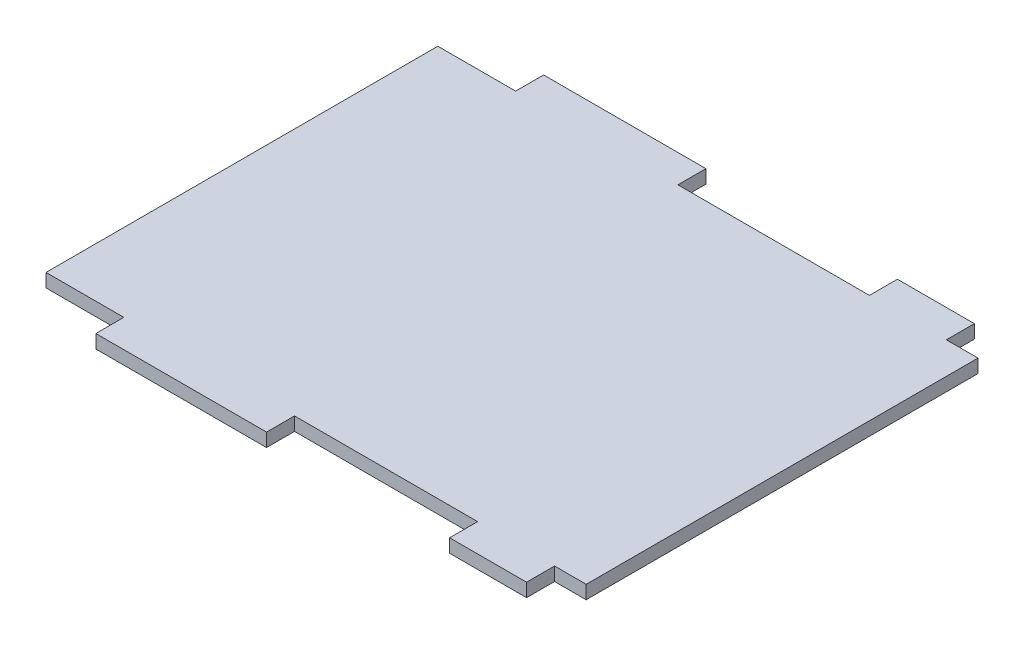
ISO-10303-21;
HEADER;
FILE_DESCRIPTION(('STEP AP214'),'2;1');
FILE_NAME('part.step','',(''),(''),'','','');
FILE_SCHEMA(('AUTOMOTIVE_DESIGN { 1 0 10303 214 1 1 1 1 }'));
ENDSEC;
DATA;
#1=APPLICATION_CONTEXT('core data for automotive mechanical design processes');
#2=APPLICATION_PROTOCOL_DEFINITION('international standard','automotive_design',2000,#1);
#3=PRODUCT_CONTEXT('',#1,'mechanical');
#4=PRODUCT('Part','Part','',(#3));
#5=PRODUCT_RELATED_PRODUCT_CATEGORY('part','',(#4));
#6=PRODUCT_DEFINITION_FORMATION('','',#4);
#7=PRODUCT_DEFINITION_CONTEXT('part definition',#1,'design');
#8=PRODUCT_DEFINITION('design','',#6,#7);
#9=PRODUCT_DEFINITION_SHAPE('','',#8);
#10=(LENGTH_UNIT() NAMED_UNIT(*) SI_UNIT(.MILLI.,.METRE.));
#11=(NAMED_UNIT(*) PLANE_ANGLE_UNIT() SI_UNIT($,.RADIAN.));
#12=(NAMED_UNIT(*) SI_UNIT($,.STERADIAN.) SOLID_ANGLE_UNIT());
#13=UNCERTAINTY_MEASURE_WITH_UNIT(LENGTH_MEASURE(1.E-05),#10,'distance_accuracy_value','');
#14=(GEOMETRIC_REPRESENTATION_CONTEXT(3) GLOBAL_UNCERTAINTY_ASSIGNED_CONTEXT((#13)) GLOBAL_UNIT_ASSIGNED_CONTEXT((#10,
#11,#12)) REPRESENTATION_CONTEXT('',''));
#15=CARTESIAN_POINT('',(0.,0.,0.));
#16=DIRECTION('',(0.,0.,1.));
#17=DIRECTION('',(1.,0.,0.));
#18=AXIS2_PLACEMENT_3D('',#15,#16,#17);
#19=CARTESIAN_POINT('',(0.,4.8,70.));
#20=DIRECTION('',(0.,0.,-1.));
#21=DIRECTION('',(-1.,0.,0.));
#22=AXIS2_PLACEMENT_3D('',#19,#20,#21);
#23=PLANE('',#22);
#24=DIRECTION('',(1.,0.,0.));
#25=VECTOR('',#24,1.);
#26=CARTESIAN_POINT('',(0.,0.,70.));
#27=LINE('',#26,#25);
#28=CARTESIAN_POINT('',(-96.5,0.,70.));
#29=VERTEX_POINT('',#28);
#30=CARTESIAN_POINT('',(-68.7,0.,70.));
#31=VERTEX_POINT('',#30);
#32=EDGE_CURVE('E325',#29,#31,#27,.T.);
#33=ORIENTED_EDGE('',*,*,#32,.T.);
#34=DIRECTION('',(0.,-1.,0.));
#35=VECTOR('',#34,1.);
#36=CARTESIAN_POINT('',(-68.7,4.8,70.));
#37=LINE('',#36,#35);
#38=CARTESIAN_POINT('',(-68.7,4.8,70.));
#39=VERTEX_POINT('',#38);
#40=EDGE_CURVE('E11',#39,#31,#37,.T.);
#41=ORIENTED_EDGE('',*,*,#40,.F.);
#42=DIRECTION('',(1.,0.,0.));
#43=VECTOR('',#42,1.);
#44=CARTESIAN_POINT('',(0.,4.8,70.));
#45=LINE('',#44,#43);
#46=CARTESIAN_POINT('',(-96.5,4.8,70.));
#47=VERTEX_POINT('',#46);
#48=EDGE_CURVE('E230',#47,#39,#45,.T.);
#49=ORIENTED_EDGE('',*,*,#48,.F.);
#50=DIRECTION('',(0.,-1.,0.));
#51=VECTOR('',#50,1.);
#52=CARTESIAN_POINT('',(-96.5,4.8,70.));
#53=LINE('',#52,#51);
#54=EDGE_CURVE('E61',#47,#29,#53,.T.);
#55=ORIENTED_EDGE('',*,*,#54,.T.);
#56=EDGE_LOOP('',(#33,#41,#49,#55));
#57=FACE_BOUND('',#56,.T.);
#58=ADVANCED_FACE('F44',(#57),#23,.F.);
#59=CARTESIAN_POINT('',(-68.7,4.8,0.));
#60=DIRECTION('',(1.,0.,0.));
#61=DIRECTION('',(0.,0.,-1.));
#62=AXIS2_PLACEMENT_3D('',#59,#60,#61);
#63=PLANE('',#62);
#64=DIRECTION('',(0.,0.,1.));
#65=VECTOR('',#64,1.);
#66=CARTESIAN_POINT('',(-68.7,0.,0.));
#67=LINE('',#66,#65);
#68=CARTESIAN_POINT('',(-68.7,0.,80.));
#69=VERTEX_POINT('',#68);
#70=EDGE_CURVE('E320',#31,#69,#67,.T.);
#71=ORIENTED_EDGE('',*,*,#70,.T.);
#72=DIRECTION('',(0.,-1.,0.));
#73=VECTOR('',#72,1.);
#74=CARTESIAN_POINT('',(-68.7,4.8,80.));
#75=LINE('',#74,#73);
#76=CARTESIAN_POINT('',(-68.7,4.8,80.));
#77=VERTEX_POINT('',#76);
#78=EDGE_CURVE('E53',#77,#69,#75,.T.);
#79=ORIENTED_EDGE('',*,*,#78,.F.);
#80=DIRECTION('',(0.,0.,1.));
#81=VECTOR('',#80,1.);
#82=CARTESIAN_POINT('',(-68.7,4.8,0.));
#83=LINE('',#82,#81);
#84=EDGE_CURVE('E135',#39,#77,#83,.T.);
#85=ORIENTED_EDGE('',*,*,#84,.F.);
#86=ORIENTED_EDGE('',*,*,#40,.T.);
#87=EDGE_LOOP('',(#71,#79,#85,#86));
#88=FACE_BOUND('',#87,.T.);
#89=ADVANCED_FACE('F46',(#88),#63,.F.);
#90=CARTESIAN_POINT('',(0.,4.8,80.));
#91=DIRECTION('',(0.,0.,-1.));
#92=DIRECTION('',(-1.,0.,0.));
#93=AXIS2_PLACEMENT_3D('',#90,#91,#92);
#94=PLANE('',#93);
#95=DIRECTION('',(1.,0.,0.));
#96=VECTOR('',#95,1.);
#97=CARTESIAN_POINT('',(0.,0.,80.));
#98=LINE('',#97,#96);
#99=CARTESIAN_POINT('',(-7.70000000000001,0.,80.));
#100=VERTEX_POINT('',#99);
#101=EDGE_CURVE('E316',#69,#100,#98,.T.);
#102=ORIENTED_EDGE('',*,*,#101,.T.);
#103=DIRECTION('',(0.,-1.,0.));
#104=VECTOR('',#103,1.);
#105=CARTESIAN_POINT('',(-7.70000000000001,4.8,80.));
#106=LINE('',#105,#104);
#107=CARTESIAN_POINT('',(-7.70000000000001,4.8,80.));
#108=VERTEX_POINT('',#107);
#109=EDGE_CURVE('E308',#108,#100,#106,.T.);
#110=ORIENTED_EDGE('',*,*,#109,.F.);
#111=DIRECTION('',(1.,0.,0.));
#112=VECTOR('',#111,1.);
#113=CARTESIAN_POINT('',(0.,4.8,80.));
#114=LINE('',#113,#112);
#115=EDGE_CURVE('E241',#77,#108,#114,.T.);
#116=ORIENTED_EDGE('',*,*,#115,.F.);
#117=ORIENTED_EDGE('',*,*,#78,.T.);
#118=EDGE_LOOP('',(#102,#110,#116,#117));
#119=FACE_BOUND('',#118,.T.);
#120=ADVANCED_FACE('F314',(#119),#94,.F.);
#121=CARTESIAN_POINT('',(-7.70000000000002,4.8,0.));
#122=DIRECTION('',(1.,0.,0.));
#123=DIRECTION('',(0.,0.,-1.));
#124=AXIS2_PLACEMENT_3D('',#121,#122,#123);
#125=PLANE('',#124);
#126=DIRECTION('',(0.,0.,1.));
#127=VECTOR('',#126,1.);
#128=CARTESIAN_POINT('',(-7.70000000000002,0.,0.));
#129=LINE('',#128,#127);
#130=CARTESIAN_POINT('',(-7.70000000000001,0.,70.));
#131=VERTEX_POINT('',#130);
#132=EDGE_CURVE('E322',#131,#100,#129,.T.);
#133=ORIENTED_EDGE('',*,*,#132,.F.);
#134=DIRECTION('',(0.,-1.,0.));
#135=VECTOR('',#134,1.);
#136=CARTESIAN_POINT('',(-7.70000000000001,4.8,70.));
#137=LINE('',#136,#135);
#138=CARTESIAN_POINT('',(-7.70000000000001,4.8,70.));
#139=VERTEX_POINT('',#138);
#140=EDGE_CURVE('E261',#139,#131,#137,.T.);
#141=ORIENTED_EDGE('',*,*,#140,.F.);
#142=DIRECTION('',(0.,0.,1.));
#143=VECTOR('',#142,1.);
#144=CARTESIAN_POINT('',(-7.70000000000002,4.8,0.));
#145=LINE('',#144,#143);
#146=EDGE_CURVE('E238',#139,#108,#145,.T.);
#147=ORIENTED_EDGE('',*,*,#146,.T.);
#148=ORIENTED_EDGE('',*,*,#109,.T.);
#149=EDGE_LOOP('',(#133,#141,#147,#148));
#150=FACE_BOUND('',#149,.T.);
#151=ADVANCED_FACE('F406',(#150),#125,.T.);
#152=CARTESIAN_POINT('',(57.7138007849793,0.,70.));
#153=VERTEX_POINT('',#152);
#154=EDGE_CURVE('E258',#131,#153,#27,.T.);
#155=ORIENTED_EDGE('',*,*,#154,.T.);
#156=DIRECTION('',(0.,-1.,0.));
#157=VECTOR('',#156,1.);
#158=CARTESIAN_POINT('',(57.7138007849793,4.8,70.));
#159=LINE('',#158,#157);
#160=CARTESIAN_POINT('',(57.7138007849793,4.8,70.));
#161=VERTEX_POINT('',#160);
#162=EDGE_CURVE('E255',#161,#153,#159,.T.);
#163=ORIENTED_EDGE('',*,*,#162,.F.);
#164=EDGE_CURVE('E229',#139,#161,#45,.T.);
#165=ORIENTED_EDGE('',*,*,#164,.F.);
#166=ORIENTED_EDGE('',*,*,#140,.T.);
#167=EDGE_LOOP('',(#155,#163,#165,#166));
#168=FACE_BOUND('',#167,.T.);
#169=ADVANCED_FACE('F256',(#168),#23,.F.);
#170=CARTESIAN_POINT('',(57.7138007849793,4.8,0.));
#171=DIRECTION('',(1.,0.,0.));
#172=DIRECTION('',(0.,0.,-1.));
#173=AXIS2_PLACEMENT_3D('',#170,#171,#172);
#174=PLANE('',#173);
#175=DIRECTION('',(0.,0.,1.));
#176=VECTOR('',#175,1.);
#177=CARTESIAN_POINT('',(57.7138007849793,0.,0.));
#178=LINE('',#177,#176);
#179=CARTESIAN_POINT('',(57.7138007849793,0.,80.));
#180=VERTEX_POINT('',#179);
#181=EDGE_CURVE('E267',#153,#180,#178,.T.);
#182=ORIENTED_EDGE('',*,*,#181,.T.);
#183=DIRECTION('',(0.,-1.,0.));
#184=VECTOR('',#183,1.);
#185=CARTESIAN_POINT('',(57.7138007849793,4.8,80.));
#186=LINE('',#185,#184);
#187=CARTESIAN_POINT('',(57.7138007849793,4.8,80.));
#188=VERTEX_POINT('',#187);
#189=EDGE_CURVE('E262',#188,#180,#186,.T.);
#190=ORIENTED_EDGE('',*,*,#189,.F.);
#191=DIRECTION('',(0.,0.,1.));
#192=VECTOR('',#191,1.);
#193=CARTESIAN_POINT('',(57.7138007849793,4.8,0.));
#194=LINE('',#193,#192);
#195=EDGE_CURVE('E236',#161,#188,#194,.T.);
#196=ORIENTED_EDGE('',*,*,#195,.F.);
#197=ORIENTED_EDGE('',*,*,#162,.T.);
#198=EDGE_LOOP('',(#182,#190,#196,#197));
#199=FACE_BOUND('',#198,.T.);
#200=ADVANCED_FACE('F264',(#199),#174,.F.);
#201=CARTESIAN_POINT('',(0.,4.8,80.));
#202=DIRECTION('',(0.,0.,-1.));
#203=DIRECTION('',(-1.,0.,0.));
#204=AXIS2_PLACEMENT_3D('',#201,#202,#203);
#205=PLANE('',#204);
#206=DIRECTION('',(1.,0.,0.));
#207=VECTOR('',#206,1.);
#208=CARTESIAN_POINT('',(0.,0.,80.));
#209=LINE('',#208,#207);
#210=CARTESIAN_POINT('',(85.1965630635409,0.,80.));
#211=VERTEX_POINT('',#210);
#212=EDGE_CURVE('E330',#180,#211,#209,.T.);
#213=ORIENTED_EDGE('',*,*,#212,.T.);
#214=DIRECTION('',(0.,-1.,0.));
#215=VECTOR('',#214,1.);
#216=CARTESIAN_POINT('',(85.1965630635409,4.8,80.));
#217=LINE('',#216,#215);
#218=CARTESIAN_POINT('',(85.1965630635409,4.8,80.));
#219=VERTEX_POINT('',#218);
#220=EDGE_CURVE('E271',#219,#211,#217,.T.);
#221=ORIENTED_EDGE('',*,*,#220,.F.);
#222=DIRECTION('',(1.,0.,0.));
#223=VECTOR('',#222,1.);
#224=CARTESIAN_POINT('',(0.,4.8,80.));
#225=LINE('',#224,#223);
#226=EDGE_CURVE('E234',#188,#219,#225,.T.);
#227=ORIENTED_EDGE('',*,*,#226,.F.);
#228=ORIENTED_EDGE('',*,*,#189,.T.);
#229=EDGE_LOOP('',(#213,#221,#227,#228));
#230=FACE_BOUND('',#229,.T.);
#231=ADVANCED_FACE('F274',(#230),#205,.F.);
#232=CARTESIAN_POINT('',(85.1965630635409,4.8,0.));
#233=DIRECTION('',(1.,0.,0.));
#234=DIRECTION('',(0.,0.,-1.));
#235=AXIS2_PLACEMENT_3D('',#232,#233,#234);
#236=PLANE('',#235);
#237=DIRECTION('',(0.,0.,1.));
#238=VECTOR('',#237,1.);
#239=CARTESIAN_POINT('',(85.1965630635409,0.,0.));
#240=LINE('',#239,#238);
#241=CARTESIAN_POINT('',(85.1965630635409,0.,70.));
#242=VERTEX_POINT('',#241);
#243=EDGE_CURVE('E283',#242,#211,#240,.T.);
#244=ORIENTED_EDGE('',*,*,#243,.F.);
#245=DIRECTION('',(0.,-1.,0.));
#246=VECTOR('',#245,1.);
#247=CARTESIAN_POINT('',(85.1965630635409,4.8,70.));
#248=LINE('',#247,#246);
#249=CARTESIAN_POINT('',(85.1965630635409,4.8,70.));
#250=VERTEX_POINT('',#249);
#251=EDGE_CURVE('E281',#250,#242,#248,.T.);
#252=ORIENTED_EDGE('',*,*,#251,.F.);
#253=DIRECTION('',(0.,0.,1.));
#254=VECTOR('',#253,1.);
#255=CARTESIAN_POINT('',(85.1965630635409,4.8,0.));
#256=LINE('',#255,#254);
#257=EDGE_CURVE('E227',#250,#219,#256,.T.);
#258=ORIENTED_EDGE('',*,*,#257,.T.);
#259=ORIENTED_EDGE('',*,*,#220,.T.);
#260=EDGE_LOOP('',(#244,#252,#258,#259));
#261=FACE_BOUND('',#260,.T.);
#262=ADVANCED_FACE('F280',(#261),#236,.T.);
#263=CARTESIAN_POINT('',(96.5,0.,70.));
#264=VERTEX_POINT('',#263);
#265=EDGE_CURVE('E290',#242,#264,#27,.T.);
#266=ORIENTED_EDGE('',*,*,#265,.T.);
#267=DIRECTION('',(0.,-1.,0.));
#268=VECTOR('',#267,1.);
#269=CARTESIAN_POINT('',(96.5,4.8,70.));
#270=LINE('',#269,#268);
#271=CARTESIAN_POINT('',(96.5,4.8,70.));
#272=VERTEX_POINT('',#271);
#273=EDGE_CURVE('E286',#272,#264,#270,.T.);
#274=ORIENTED_EDGE('',*,*,#273,.F.);
#275=EDGE_CURVE('E224',#250,#272,#45,.T.);
#276=ORIENTED_EDGE('',*,*,#275,.F.);
#277=ORIENTED_EDGE('',*,*,#251,.T.);
#278=EDGE_LOOP('',(#266,#274,#276,#277));
#279=FACE_BOUND('',#278,.T.);
#280=ADVANCED_FACE('F288',(#279),#23,.F.);
#281=CARTESIAN_POINT('',(96.5,4.8,0.));
#282=DIRECTION('',(-1.,0.,0.));
#283=DIRECTION('',(0.,0.,1.));
#284=AXIS2_PLACEMENT_3D('',#281,#282,#283);
#285=PLANE('',#284);
#286=DIRECTION('',(0.,0.,-1.));
#287=VECTOR('',#286,1.);
#288=CARTESIAN_POINT('',(96.5,0.,0.));
#289=LINE('',#288,#287);
#290=CARTESIAN_POINT('',(96.5,0.,-70.));
#291=VERTEX_POINT('',#290);
#292=EDGE_CURVE('E297',#264,#291,#289,.T.);
#293=ORIENTED_EDGE('',*,*,#292,.T.);
#294=DIRECTION('',(0.,-1.,0.));
#295=VECTOR('',#294,1.);
#296=CARTESIAN_POINT('',(96.5,4.8,-70.));
#297=LINE('',#296,#295);
#298=CARTESIAN_POINT('',(96.5,4.8,-70.));
#299=VERTEX_POINT('',#298);
#300=EDGE_CURVE('E294',#299,#291,#297,.T.);
#301=ORIENTED_EDGE('',*,*,#300,.F.);
#302=DIRECTION('',(0.,0.,-1.));
#303=VECTOR('',#302,1.);
#304=CARTESIAN_POINT('',(96.5,4.8,0.));
#305=LINE('',#304,#303);
#306=EDGE_CURVE('E220',#272,#299,#305,.T.);
#307=ORIENTED_EDGE('',*,*,#306,.F.);
#308=ORIENTED_EDGE('',*,*,#273,.T.);
#309=EDGE_LOOP('',(#293,#301,#307,#308));
#310=FACE_BOUND('',#309,.T.);
#311=ADVANCED_FACE('F296',(#310),#285,.F.);
#312=CARTESIAN_POINT('',(0.,4.8,-70.));
#313=DIRECTION('',(0.,0.,-1.));
#314=DIRECTION('',(-1.,0.,0.));
#315=AXIS2_PLACEMENT_3D('',#312,#313,#314);
#316=PLANE('',#315);
#317=DIRECTION('',(1.,0.,0.));
#318=VECTOR('',#317,1.);
#319=CARTESIAN_POINT('',(0.,0.,-70.));
#320=LINE('',#319,#318);
#321=CARTESIAN_POINT('',(85.1965630635409,0.,-70.));
#322=VERTEX_POINT('',#321);
#323=EDGE_CURVE('E334',#322,#291,#320,.T.);
#324=ORIENTED_EDGE('',*,*,#323,.F.);
#325=DIRECTION('',(0.,-1.,0.));
#326=VECTOR('',#325,1.);
#327=CARTESIAN_POINT('',(85.1965630635409,4.8,-70.));
#328=LINE('',#327,#326);
#329=CARTESIAN_POINT('',(85.1965630635409,4.8,-70.));
#330=VERTEX_POINT('',#329);
#331=EDGE_CURVE('E300',#330,#322,#328,.T.);
#332=ORIENTED_EDGE('',*,*,#331,.F.);
#333=DIRECTION('',(1.,0.,0.));
#334=VECTOR('',#333,1.);
#335=CARTESIAN_POINT('',(0.,4.8,-70.));
#336=LINE('',#335,#334);
#337=EDGE_CURVE('E211',#330,#299,#336,.T.);
#338=ORIENTED_EDGE('',*,*,#337,.T.);
#339=ORIENTED_EDGE('',*,*,#300,.T.);
#340=EDGE_LOOP('',(#324,#332,#338,#339));
#341=FACE_BOUND('',#340,.T.);
#342=ADVANCED_FACE('F395',(#341),#316,.T.);
#343=CARTESIAN_POINT('',(85.1965630635409,4.8,0.));
#344=DIRECTION('',(-1.,0.,0.));
#345=DIRECTION('',(0.,0.,1.));
#346=AXIS2_PLACEMENT_3D('',#343,#344,#345);
#347=PLANE('',#346);
#348=DIRECTION('',(0.,0.,-1.));
#349=VECTOR('',#348,1.);
#350=CARTESIAN_POINT('',(85.1965630635409,0.,0.));
#351=LINE('',#350,#349);
#352=CARTESIAN_POINT('',(85.1965630635409,0.,-80.));
#353=VERTEX_POINT('',#352);
#354=EDGE_CURVE('E336',#322,#353,#351,.T.);
#355=ORIENTED_EDGE('',*,*,#354,.T.);
#356=DIRECTION('',(0.,-1.,0.));
#357=VECTOR('',#356,1.);
#358=CARTESIAN_POINT('',(85.1965630635409,4.8,-80.));
#359=LINE('',#358,#357);
#360=CARTESIAN_POINT('',(85.1965630635409,4.8,-80.));
#361=VERTEX_POINT('',#360);
#362=EDGE_CURVE('E302',#361,#353,#359,.T.);
#363=ORIENTED_EDGE('',*,*,#362,.F.);
#364=DIRECTION('',(0.,0.,-1.));
#365=VECTOR('',#364,1.);
#366=CARTESIAN_POINT('',(85.1965630635409,4.8,0.));
#367=LINE('',#366,#365);
#368=EDGE_CURVE('E219',#330,#361,#367,.T.);
#369=ORIENTED_EDGE('',*,*,#368,.F.);
#370=ORIENTED_EDGE('',*,*,#331,.T.);
#371=EDGE_LOOP('',(#355,#363,#369,#370));
#372=FACE_BOUND('',#371,.T.);
#373=ADVANCED_FACE('F372',(#372),#347,.F.);
#374=CARTESIAN_POINT('',(0.,4.8,-80.));
#375=DIRECTION('',(0.,0.,-1.));
#376=DIRECTION('',(-1.,0.,0.));
#377=AXIS2_PLACEMENT_3D('',#374,#375,#376);
#378=PLANE('',#377);
#379=DIRECTION('',(1.,0.,0.));
#380=VECTOR('',#379,1.);
#381=CARTESIAN_POINT('',(0.,0.,-80.));
#382=LINE('',#381,#380);
#383=CARTESIAN_POINT('',(57.7138007849793,0.,-80.));
#384=VERTEX_POINT('',#383);
#385=EDGE_CURVE('E340',#384,#353,#382,.T.);
#386=ORIENTED_EDGE('',*,*,#385,.F.);
#387=DIRECTION('',(0.,-1.,0.));
#388=VECTOR('',#387,1.);
#389=CARTESIAN_POINT('',(57.7138007849793,4.8,-80.));
#390=LINE('',#389,#388);
#391=CARTESIAN_POINT('',(57.7138007849793,4.8,-80.));
#392=VERTEX_POINT('',#391);
#393=EDGE_CURVE('E362',#392,#384,#390,.T.);
#394=ORIENTED_EDGE('',*,*,#393,.F.);
#395=DIRECTION('',(1.,0.,0.));
#396=VECTOR('',#395,1.);
#397=CARTESIAN_POINT('',(0.,4.8,-80.));
#398=LINE('',#397,#396);
#399=EDGE_CURVE('E223',#392,#361,#398,.T.);
#400=ORIENTED_EDGE('',*,*,#399,.T.);
#401=ORIENTED_EDGE('',*,*,#362,.T.);
#402=EDGE_LOOP('',(#386,#394,#400,#401));
#403=FACE_BOUND('',#402,.T.);
#404=ADVANCED_FACE('F367',(#403),#378,.T.);
#405=CARTESIAN_POINT('',(57.7138007849793,4.8,0.));
#406=DIRECTION('',(-1.,0.,0.));
#407=DIRECTION('',(0.,0.,1.));
#408=AXIS2_PLACEMENT_3D('',#405,#406,#407);
#409=PLANE('',#408);
#410=DIRECTION('',(0.,0.,-1.));
#411=VECTOR('',#410,1.);
#412=CARTESIAN_POINT('',(57.7138007849793,0.,0.));
#413=LINE('',#412,#411);
#414=CARTESIAN_POINT('',(57.7138007849793,0.,-70.));
#415=VERTEX_POINT('',#414);
#416=EDGE_CURVE('E343',#415,#384,#413,.T.);
#417=ORIENTED_EDGE('',*,*,#416,.F.);
#418=DIRECTION('',(0.,-1.,0.));
#419=VECTOR('',#418,1.);
#420=CARTESIAN_POINT('',(57.7138007849793,4.8,-70.));
#421=LINE('',#420,#419);
#422=CARTESIAN_POINT('',(57.7138007849793,4.8,-70.));
#423=VERTEX_POINT('',#422);
#424=EDGE_CURVE('E360',#423,#415,#421,.T.);
#425=ORIENTED_EDGE('',*,*,#424,.F.);
#426=DIRECTION('',(0.,0.,-1.));
#427=VECTOR('',#426,1.);
#428=CARTESIAN_POINT('',(57.7138007849793,4.8,0.));
#429=LINE('',#428,#427);
#430=EDGE_CURVE('E217',#423,#392,#429,.T.);
#431=ORIENTED_EDGE('',*,*,#430,.T.);
#432=ORIENTED_EDGE('',*,*,#393,.T.);
#433=EDGE_LOOP('',(#417,#425,#431,#432));
#434=FACE_BOUND('',#433,.T.);
#435=ADVANCED_FACE('F378',(#434),#409,.T.);
#436=CARTESIAN_POINT('',(-10.718277288639,0.,-70.));
#437=VERTEX_POINT('',#436);
#438=EDGE_CURVE('E337',#437,#415,#320,.T.);
#439=ORIENTED_EDGE('',*,*,#438,.F.);
#440=DIRECTION('',(0.,-1.,0.));
#441=VECTOR('',#440,1.);
#442=CARTESIAN_POINT('',(-10.718277288639,4.8,-70.));
#443=LINE('',#442,#441);
#444=CARTESIAN_POINT('',(-10.718277288639,4.8,-70.));
#445=VERTEX_POINT('',#444);
#446=EDGE_CURVE('E358',#445,#437,#443,.T.);
#447=ORIENTED_EDGE('',*,*,#446,.F.);
#448=EDGE_CURVE('E210',#445,#423,#336,.T.);
#449=ORIENTED_EDGE('',*,*,#448,.T.);
#450=ORIENTED_EDGE('',*,*,#424,.T.);
#451=EDGE_LOOP('',(#439,#447,#449,#450));
#452=FACE_BOUND('',#451,.T.);
#453=ADVANCED_FACE('F396',(#452),#316,.T.);
#454=CARTESIAN_POINT('',(-10.718277288639,4.8,0.));
#455=DIRECTION('',(-1.,0.,0.));
#456=DIRECTION('',(0.,0.,1.));
#457=AXIS2_PLACEMENT_3D('',#454,#455,#456);
#458=PLANE('',#457);
#459=DIRECTION('',(0.,0.,-1.));
#460=VECTOR('',#459,1.);
#461=CARTESIAN_POINT('',(-10.718277288639,0.,0.));
#462=LINE('',#461,#460);
#463=CARTESIAN_POINT('',(-10.718277288639,0.,-80.));
#464=VERTEX_POINT('',#463);
#465=EDGE_CURVE('E346',#437,#464,#462,.T.);
#466=ORIENTED_EDGE('',*,*,#465,.T.);
#467=DIRECTION('',(0.,-1.,0.));
#468=VECTOR('',#467,1.);
#469=CARTESIAN_POINT('',(-10.718277288639,4.8,-80.));
#470=LINE('',#469,#468);
#471=CARTESIAN_POINT('',(-10.718277288639,4.8,-80.));
#472=VERTEX_POINT('',#471);
#473=EDGE_CURVE('E356',#472,#464,#470,.T.);
#474=ORIENTED_EDGE('',*,*,#473,.F.);
#475=DIRECTION('',(0.,0.,-1.));
#476=VECTOR('',#475,1.);
#477=CARTESIAN_POINT('',(-10.718277288639,4.8,0.));
#478=LINE('',#477,#476);
#479=EDGE_CURVE('E216',#445,#472,#478,.T.);
#480=ORIENTED_EDGE('',*,*,#479,.F.);
#481=ORIENTED_EDGE('',*,*,#446,.T.);
#482=EDGE_LOOP('',(#466,#474,#480,#481));
#483=FACE_BOUND('',#482,.T.);
#484=ADVANCED_FACE('F514',(#483),#458,.F.);
#485=CARTESIAN_POINT('',(0.,4.8,-80.));
#486=DIRECTION('',(0.,0.,-1.));
#487=DIRECTION('',(-1.,0.,0.));
#488=AXIS2_PLACEMENT_3D('',#485,#486,#487);
#489=PLANE('',#488);
#490=DIRECTION('',(1.,0.,0.));
#491=VECTOR('',#490,1.);
#492=CARTESIAN_POINT('',(0.,0.,-80.));
#493=LINE('',#492,#491);
#494=CARTESIAN_POINT('',(-68.7,0.,-80.));
#495=VERTEX_POINT('',#494);
#496=EDGE_CURVE('E349',#495,#464,#493,.T.);
#497=ORIENTED_EDGE('',*,*,#496,.F.);
#498=DIRECTION('',(0.,-1.,0.));
#499=VECTOR('',#498,1.);
#500=CARTESIAN_POINT('',(-68.7,4.8,-80.));
#501=LINE('',#500,#499);
#502=CARTESIAN_POINT('',(-68.7,4.8,-80.));
#503=VERTEX_POINT('',#502);
#504=EDGE_CURVE('E196',#503,#495,#501,.T.);
#505=ORIENTED_EDGE('',*,*,#504,.F.);
#506=DIRECTION('',(1.,0.,0.));
#507=VECTOR('',#506,1.);
#508=CARTESIAN_POINT('',(0.,4.8,-80.));
#509=LINE('',#508,#507);
#510=EDGE_CURVE('E205',#503,#472,#509,.T.);
#511=ORIENTED_EDGE('',*,*,#510,.T.);
#512=ORIENTED_EDGE('',*,*,#473,.T.);
#513=EDGE_LOOP('',(#497,#505,#511,#512));
#514=FACE_BOUND('',#513,.T.);
#515=ADVANCED_FACE('F529',(#514),#489,.T.);
#516=CARTESIAN_POINT('',(-68.7,4.8,0.));
#517=DIRECTION('',(-1.,0.,0.));
#518=DIRECTION('',(0.,0.,1.));
#519=AXIS2_PLACEMENT_3D('',#516,#517,#518);
#520=PLANE('',#519);
#521=DIRECTION('',(0.,0.,-1.));
#522=VECTOR('',#521,1.);
#523=CARTESIAN_POINT('',(-68.7,0.,0.));
#524=LINE('',#523,#522);
#525=CARTESIAN_POINT('',(-68.7,0.,-70.));
#526=VERTEX_POINT('',#525);
#527=EDGE_CURVE('E192',#526,#495,#524,.T.);
#528=ORIENTED_EDGE('',*,*,#527,.F.);
#529=DIRECTION('',(0.,-1.,0.));
#530=VECTOR('',#529,1.);
#531=CARTESIAN_POINT('',(-68.7,4.8,-70.));
#532=LINE('',#531,#530);
#533=CARTESIAN_POINT('',(-68.7,4.8,-70.));
#534=VERTEX_POINT('',#533);
#535=EDGE_CURVE('E187',#534,#526,#532,.T.);
#536=ORIENTED_EDGE('',*,*,#535,.F.);
#537=DIRECTION('',(0.,0.,-1.));
#538=VECTOR('',#537,1.);
#539=CARTESIAN_POINT('',(-68.7,4.8,0.));
#540=LINE('',#539,#538);
#541=EDGE_CURVE('E190',#534,#503,#540,.T.);
#542=ORIENTED_EDGE('',*,*,#541,.T.);
#543=ORIENTED_EDGE('',*,*,#504,.T.);
#544=EDGE_LOOP('',(#528,#536,#542,#543));
#545=FACE_BOUND('',#544,.T.);
#546=ADVANCED_FACE('F189',(#545),#520,.T.);
#547=CARTESIAN_POINT('',(-96.5,0.,-70.));
#548=VERTEX_POINT('',#547);
#549=EDGE_CURVE('E246',#548,#526,#320,.T.);
#550=ORIENTED_EDGE('',*,*,#549,.F.);
#551=DIRECTION('',(0.,-1.,0.));
#552=VECTOR('',#551,1.);
#553=CARTESIAN_POINT('',(-96.5,4.8,-70.));
#554=LINE('',#553,#552);
#555=CARTESIAN_POINT('',(-96.5,4.8,-70.));
#556=VERTEX_POINT('',#555);
#557=EDGE_CURVE('E123',#556,#548,#554,.T.);
#558=ORIENTED_EDGE('',*,*,#557,.F.);
#559=EDGE_CURVE('E203',#556,#534,#336,.T.);
#560=ORIENTED_EDGE('',*,*,#559,.T.);
#561=ORIENTED_EDGE('',*,*,#535,.T.);
#562=EDGE_LOOP('',(#550,#558,#560,#561));
#563=FACE_BOUND('',#562,.T.);
#564=ADVANCED_FACE('F207',(#563),#316,.T.);
#565=CARTESIAN_POINT('',(-96.5,4.8,0.));
#566=DIRECTION('',(-1.,0.,0.));
#567=DIRECTION('',(0.,0.,1.));
#568=AXIS2_PLACEMENT_3D('',#565,#566,#567);
#569=PLANE('',#568);
#570=DIRECTION('',(0.,0.,-1.));
#571=VECTOR('',#570,1.);
#572=CARTESIAN_POINT('',(-96.5,0.,0.));
#573=LINE('',#572,#571);
#574=EDGE_CURVE('E243',#29,#548,#573,.T.);
#575=ORIENTED_EDGE('',*,*,#574,.F.);
#576=ORIENTED_EDGE('',*,*,#54,.F.);
#577=DIRECTION('',(0.,0.,-1.));
#578=VECTOR('',#577,1.);
#579=CARTESIAN_POINT('',(-96.5,4.8,0.));
#580=LINE('',#579,#578);
#581=EDGE_CURVE('E208',#47,#556,#580,.T.);
#582=ORIENTED_EDGE('',*,*,#581,.T.);
#583=ORIENTED_EDGE('',*,*,#557,.T.);
#584=EDGE_LOOP('',(#575,#576,#582,#583));
#585=FACE_BOUND('',#584,.T.);
#586=ADVANCED_FACE('F386',(#585),#569,.T.);
#587=CARTESIAN_POINT('',(0.,4.8,0.));
#588=DIRECTION('',(0.,1.,0.));
#589=DIRECTION('',(0.,0.,1.));
#590=AXIS2_PLACEMENT_3D('',#587,#588,#589);
#591=PLANE('',#590);
#592=ORIENTED_EDGE('',*,*,#48,.T.);
#593=ORIENTED_EDGE('',*,*,#84,.T.);
#594=ORIENTED_EDGE('',*,*,#115,.T.);
#595=ORIENTED_EDGE('',*,*,#146,.F.);
#596=ORIENTED_EDGE('',*,*,#164,.T.);
#597=ORIENTED_EDGE('',*,*,#195,.T.);
#598=ORIENTED_EDGE('',*,*,#226,.T.);
#599=ORIENTED_EDGE('',*,*,#257,.F.);
#600=ORIENTED_EDGE('',*,*,#275,.T.);
#601=ORIENTED_EDGE('',*,*,#306,.T.);
#602=ORIENTED_EDGE('',*,*,#337,.F.);
#603=ORIENTED_EDGE('',*,*,#368,.T.);
#604=ORIENTED_EDGE('',*,*,#399,.F.);
#605=ORIENTED_EDGE('',*,*,#430,.F.);
#606=ORIENTED_EDGE('',*,*,#448,.F.);
#607=ORIENTED_EDGE('',*,*,#479,.T.);
#608=ORIENTED_EDGE('',*,*,#510,.F.);
#609=ORIENTED_EDGE('',*,*,#541,.F.);
#610=ORIENTED_EDGE('',*,*,#559,.F.);
#611=ORIENTED_EDGE('',*,*,#581,.F.);
#612=EDGE_LOOP('',(#592,#593,#594,#595,#596,#597,#598,#599,#600,#601,#602,#603,#604,#605,#606,
#607,#608,#609,#610,#611));
#613=FACE_BOUND('',#612,.T.);
#614=ADVANCED_FACE('F201',(#613),#591,.T.);
#615=CARTESIAN_POINT('',(0.,0.,0.));
#616=DIRECTION('',(0.,1.,0.));
#617=DIRECTION('',(0.,0.,1.));
#618=AXIS2_PLACEMENT_3D('',#615,#616,#617);
#619=PLANE('',#618);
#620=ORIENTED_EDGE('',*,*,#32,.F.);
#621=ORIENTED_EDGE('',*,*,#574,.T.);
#622=ORIENTED_EDGE('',*,*,#549,.T.);
#623=ORIENTED_EDGE('',*,*,#527,.T.);
#624=ORIENTED_EDGE('',*,*,#496,.T.);
#625=ORIENTED_EDGE('',*,*,#465,.F.);
#626=ORIENTED_EDGE('',*,*,#438,.T.);
#627=ORIENTED_EDGE('',*,*,#416,.T.);
#628=ORIENTED_EDGE('',*,*,#385,.T.);
#629=ORIENTED_EDGE('',*,*,#354,.F.);
#630=ORIENTED_EDGE('',*,*,#323,.T.);
#631=ORIENTED_EDGE('',*,*,#292,.F.);
#632=ORIENTED_EDGE('',*,*,#265,.F.);
#633=ORIENTED_EDGE('',*,*,#243,.T.);
#634=ORIENTED_EDGE('',*,*,#212,.F.);
#635=ORIENTED_EDGE('',*,*,#181,.F.);
#636=ORIENTED_EDGE('',*,*,#154,.F.);
#637=ORIENTED_EDGE('',*,*,#132,.T.);
#638=ORIENTED_EDGE('',*,*,#101,.F.);
#639=ORIENTED_EDGE('',*,*,#70,.F.);
#640=EDGE_LOOP('',(#620,#621,#622,#623,#624,#625,#626,#627,#628,#629,#630,#631,#632,#633,#634,
#635,#636,#637,#638,#639));
#641=FACE_BOUND('',#640,.T.);
#642=ADVANCED_FACE('F319',(#641),#619,.F.);
#643=CLOSED_SHELL('',(#58,#89,#120,#151,#169,#200,#231,#262,#280,#311,#342,#373,#404,#435,#453,
#484,#515,#546,#564,#586,#614,#642));
#644=MANIFOLD_SOLID_BREP('B2',#643);
#645=ADVANCED_BREP_SHAPE_REPRESENTATION('',(#18,#644),#14);
#646=SHAPE_DEFINITION_REPRESENTATION(#9,#645);
ENDSEC;
END-ISO-10303-21;
